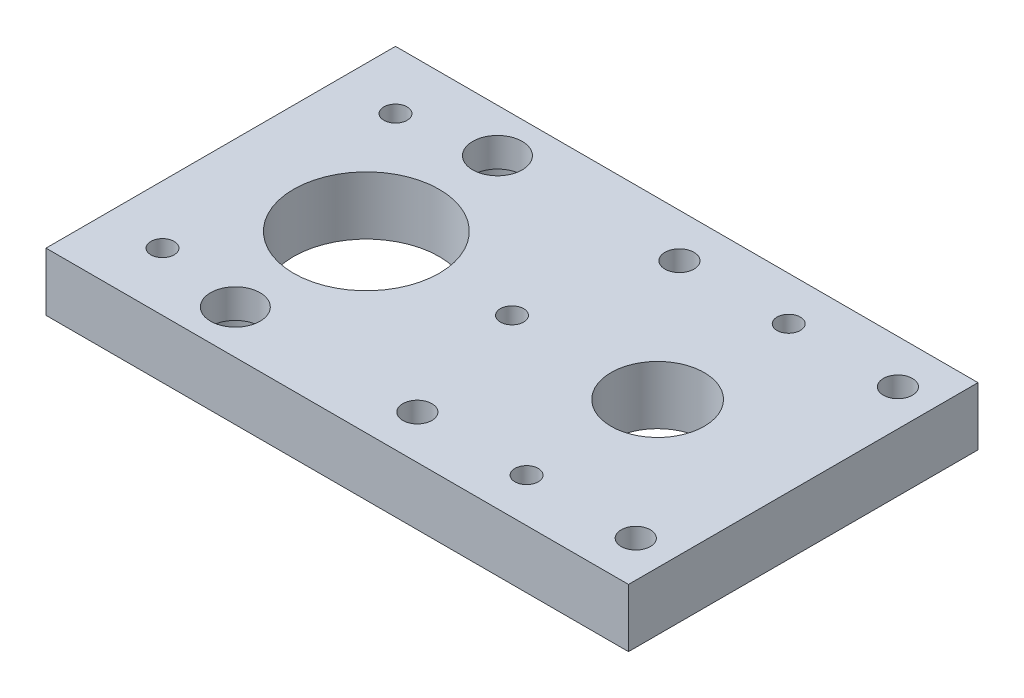
ISO-10303-21;
HEADER;
FILE_DESCRIPTION(('STEP AP214'),'2;1');
FILE_NAME('part.step','',(''),(''),'','','');
FILE_SCHEMA(('AUTOMOTIVE_DESIGN { 1 0 10303 214 1 1 1 1 }'));
ENDSEC;
DATA;
#1=APPLICATION_CONTEXT('core data for automotive mechanical design processes');
#2=APPLICATION_PROTOCOL_DEFINITION('international standard','automotive_design',2000,#1);
#3=PRODUCT_CONTEXT('',#1,'mechanical');
#4=PRODUCT('Part','Part','',(#3));
#5=PRODUCT_RELATED_PRODUCT_CATEGORY('part','',(#4));
#6=PRODUCT_DEFINITION_FORMATION('','',#4);
#7=PRODUCT_DEFINITION_CONTEXT('part definition',#1,'design');
#8=PRODUCT_DEFINITION('design','',#6,#7);
#9=PRODUCT_DEFINITION_SHAPE('','',#8);
#10=(LENGTH_UNIT() NAMED_UNIT(*) SI_UNIT(.MILLI.,.METRE.));
#11=(NAMED_UNIT(*) PLANE_ANGLE_UNIT() SI_UNIT($,.RADIAN.));
#12=(NAMED_UNIT(*) SI_UNIT($,.STERADIAN.) SOLID_ANGLE_UNIT());
#13=UNCERTAINTY_MEASURE_WITH_UNIT(LENGTH_MEASURE(1.E-05),#10,'distance_accuracy_value','');
#14=(GEOMETRIC_REPRESENTATION_CONTEXT(3) GLOBAL_UNCERTAINTY_ASSIGNED_CONTEXT((#13)) GLOBAL_UNIT_ASSIGNED_CONTEXT((#10,
#11,#12)) REPRESENTATION_CONTEXT('',''));
#15=CARTESIAN_POINT('',(0.,0.,0.));
#16=DIRECTION('',(0.,0.,1.));
#17=DIRECTION('',(1.,0.,0.));
#18=AXIS2_PLACEMENT_3D('',#15,#16,#17);
#19=CARTESIAN_POINT('',(0.,2.,0.));
#20=DIRECTION('',(0.,-1.,0.));
#21=DIRECTION('',(0.,0.,-1.));
#22=AXIS2_PLACEMENT_3D('',#19,#20,#21);
#23=CYLINDRICAL_SURFACE('',#22,1.6);
#24=CARTESIAN_POINT('',(0.,2.,0.));
#25=DIRECTION('',(0.,1.,0.));
#26=DIRECTION('',(0.,0.,1.));
#27=AXIS2_PLACEMENT_3D('',#24,#25,#26);
#28=CIRCLE('',#27,1.6);
#29=CARTESIAN_POINT('',(0.,2.,1.60000000000001));
#30=VERTEX_POINT('',#29);
#31=EDGE_CURVE('E242',#30,#30,#28,.T.);
#32=ORIENTED_EDGE('',*,*,#31,.T.);
#33=EDGE_LOOP('',(#32));
#34=FACE_BOUND('',#33,.T.);
#35=CARTESIAN_POINT('',(0.,0.,0.));
#36=DIRECTION('',(0.,1.,0.));
#37=DIRECTION('',(0.,0.,1.));
#38=AXIS2_PLACEMENT_3D('',#35,#36,#37);
#39=CIRCLE('',#38,1.6);
#40=CARTESIAN_POINT('',(0.,0.,1.60000000000001));
#41=VERTEX_POINT('',#40);
#42=EDGE_CURVE('E236',#41,#41,#39,.T.);
#43=ORIENTED_EDGE('',*,*,#42,.F.);
#44=EDGE_LOOP('',(#43));
#45=FACE_BOUND('',#44,.T.);
#46=ADVANCED_FACE('F133',(#34,#45),#23,.F.);
#47=CARTESIAN_POINT('',(-10.,2.,0.));
#48=DIRECTION('',(0.,-1.,0.));
#49=DIRECTION('',(0.,0.,-1.));
#50=AXIS2_PLACEMENT_3D('',#47,#48,#49);
#51=CYLINDRICAL_SURFACE('',#50,2.5);
#52=CARTESIAN_POINT('',(-10.,2.,0.));
#53=DIRECTION('',(0.,1.,0.));
#54=DIRECTION('',(0.,0.,1.));
#55=AXIS2_PLACEMENT_3D('',#52,#53,#54);
#56=CIRCLE('',#55,2.5);
#57=CARTESIAN_POINT('',(-10.,2.,2.50000000000001));
#58=VERTEX_POINT('',#57);
#59=EDGE_CURVE('E239',#58,#58,#56,.T.);
#60=ORIENTED_EDGE('',*,*,#59,.T.);
#61=EDGE_LOOP('',(#60));
#62=FACE_BOUND('',#61,.T.);
#63=CARTESIAN_POINT('',(-10.,0.,0.));
#64=DIRECTION('',(0.,1.,0.));
#65=DIRECTION('',(0.,0.,1.));
#66=AXIS2_PLACEMENT_3D('',#63,#64,#65);
#67=CIRCLE('',#66,2.5);
#68=CARTESIAN_POINT('',(-10.,0.,2.50000000000001));
#69=VERTEX_POINT('',#68);
#70=EDGE_CURVE('E252',#69,#69,#67,.T.);
#71=ORIENTED_EDGE('',*,*,#70,.F.);
#72=EDGE_LOOP('',(#71));
#73=FACE_BOUND('',#72,.T.);
#74=ADVANCED_FACE('F261',(#62,#73),#51,.F.);
#75=CARTESIAN_POINT('',(-15.,2.,0.));
#76=DIRECTION('',(1.,0.,0.));
#77=DIRECTION('',(0.,0.,-1.));
#78=AXIS2_PLACEMENT_3D('',#75,#76,#77);
#79=PLANE('',#78);
#80=DIRECTION('',(0.,0.,1.));
#81=VECTOR('',#80,1.);
#82=CARTESIAN_POINT('',(-15.,0.,0.));
#83=LINE('',#82,#81);
#84=CARTESIAN_POINT('',(-15.,0.,-6.));
#85=VERTEX_POINT('',#84);
#86=CARTESIAN_POINT('',(-15.,0.,6.));
#87=VERTEX_POINT('',#86);
#88=EDGE_CURVE('E196',#85,#87,#83,.T.);
#89=ORIENTED_EDGE('',*,*,#88,.T.);
#90=DIRECTION('',(0.,-1.,0.));
#91=VECTOR('',#90,1.);
#92=CARTESIAN_POINT('',(-15.,2.,6.));
#93=LINE('',#92,#91);
#94=CARTESIAN_POINT('',(-15.,2.,6.));
#95=VERTEX_POINT('',#94);
#96=EDGE_CURVE('E143',#95,#87,#93,.T.);
#97=ORIENTED_EDGE('',*,*,#96,.F.);
#98=DIRECTION('',(0.,0.,1.));
#99=VECTOR('',#98,1.);
#100=CARTESIAN_POINT('',(-15.,2.,0.));
#101=LINE('',#100,#99);
#102=CARTESIAN_POINT('',(-15.,2.,-6.));
#103=VERTEX_POINT('',#102);
#104=EDGE_CURVE('E186',#103,#95,#101,.T.);
#105=ORIENTED_EDGE('',*,*,#104,.F.);
#106=DIRECTION('',(0.,-1.,0.));
#107=VECTOR('',#106,1.);
#108=CARTESIAN_POINT('',(-15.,2.,-6.));
#109=LINE('',#108,#107);
#110=EDGE_CURVE('E13',#103,#85,#109,.T.);
#111=ORIENTED_EDGE('',*,*,#110,.T.);
#112=EDGE_LOOP('',(#89,#97,#105,#111));
#113=FACE_BOUND('',#112,.T.);
#114=ADVANCED_FACE('F194',(#113),#79,.F.);
#115=CARTESIAN_POINT('',(0.,2.,6.));
#116=DIRECTION('',(0.,0.,-1.));
#117=DIRECTION('',(-1.,0.,0.));
#118=AXIS2_PLACEMENT_3D('',#115,#116,#117);
#119=PLANE('',#118);
#120=DIRECTION('',(1.,0.,0.));
#121=VECTOR('',#120,1.);
#122=CARTESIAN_POINT('',(0.,0.,6.));
#123=LINE('',#122,#121);
#124=CARTESIAN_POINT('',(4.99999999999999,0.,6.));
#125=VERTEX_POINT('',#124);
#126=EDGE_CURVE('E247',#87,#125,#123,.T.);
#127=ORIENTED_EDGE('',*,*,#126,.T.);
#128=DIRECTION('',(0.,-1.,0.));
#129=VECTOR('',#128,1.);
#130=CARTESIAN_POINT('',(4.99999999999999,2.,6.));
#131=LINE('',#130,#129);
#132=CARTESIAN_POINT('',(4.99999999999999,2.,6.));
#133=VERTEX_POINT('',#132);
#134=EDGE_CURVE('E166',#133,#125,#131,.T.);
#135=ORIENTED_EDGE('',*,*,#134,.F.);
#136=DIRECTION('',(1.,0.,0.));
#137=VECTOR('',#136,1.);
#138=CARTESIAN_POINT('',(0.,2.,6.));
#139=LINE('',#138,#137);
#140=EDGE_CURVE('E178',#95,#133,#139,.T.);
#141=ORIENTED_EDGE('',*,*,#140,.F.);
#142=ORIENTED_EDGE('',*,*,#96,.T.);
#143=EDGE_LOOP('',(#127,#135,#141,#142));
#144=FACE_BOUND('',#143,.T.);
#145=ADVANCED_FACE('F180',(#144),#119,.F.);
#146=CARTESIAN_POINT('',(4.99999999999999,2.,0.));
#147=DIRECTION('',(1.,0.,0.));
#148=DIRECTION('',(0.,0.,-1.));
#149=AXIS2_PLACEMENT_3D('',#146,#147,#148);
#150=PLANE('',#149);
#151=DIRECTION('',(0.,0.,1.));
#152=VECTOR('',#151,1.);
#153=CARTESIAN_POINT('',(4.99999999999999,0.,0.));
#154=LINE('',#153,#152);
#155=CARTESIAN_POINT('',(4.99999999999999,0.,-6.));
#156=VERTEX_POINT('',#155);
#157=EDGE_CURVE('E249',#156,#125,#154,.T.);
#158=ORIENTED_EDGE('',*,*,#157,.F.);
#159=DIRECTION('',(0.,-1.,0.));
#160=VECTOR('',#159,1.);
#161=CARTESIAN_POINT('',(4.99999999999999,2.,-6.));
#162=LINE('',#161,#160);
#163=CARTESIAN_POINT('',(4.99999999999999,2.,-6.));
#164=VERTEX_POINT('',#163);
#165=EDGE_CURVE('E152',#164,#156,#162,.T.);
#166=ORIENTED_EDGE('',*,*,#165,.F.);
#167=DIRECTION('',(0.,0.,1.));
#168=VECTOR('',#167,1.);
#169=CARTESIAN_POINT('',(4.99999999999999,2.,0.));
#170=LINE('',#169,#168);
#171=EDGE_CURVE('E185',#164,#133,#170,.T.);
#172=ORIENTED_EDGE('',*,*,#171,.T.);
#173=ORIENTED_EDGE('',*,*,#134,.T.);
#174=EDGE_LOOP('',(#158,#166,#172,#173));
#175=FACE_BOUND('',#174,.T.);
#176=ADVANCED_FACE('F272',(#175),#150,.T.);
#177=CARTESIAN_POINT('',(0.,2.,-6.));
#178=DIRECTION('',(0.,0.,-1.));
#179=DIRECTION('',(-1.,0.,0.));
#180=AXIS2_PLACEMENT_3D('',#177,#178,#179);
#181=PLANE('',#180);
#182=DIRECTION('',(1.,0.,0.));
#183=VECTOR('',#182,1.);
#184=CARTESIAN_POINT('',(0.,0.,-6.));
#185=LINE('',#184,#183);
#186=EDGE_CURVE('E234',#85,#156,#185,.T.);
#187=ORIENTED_EDGE('',*,*,#186,.F.);
#188=ORIENTED_EDGE('',*,*,#110,.F.);
#189=DIRECTION('',(1.,0.,0.));
#190=VECTOR('',#189,1.);
#191=CARTESIAN_POINT('',(0.,2.,-6.));
#192=LINE('',#191,#190);
#193=EDGE_CURVE('E191',#103,#164,#192,.T.);
#194=ORIENTED_EDGE('',*,*,#193,.T.);
#195=ORIENTED_EDGE('',*,*,#165,.T.);
#196=EDGE_LOOP('',(#187,#188,#194,#195));
#197=FACE_BOUND('',#196,.T.);
#198=ADVANCED_FACE('F135',(#197),#181,.T.);
#199=CARTESIAN_POINT('',(0.,0.,0.));
#200=DIRECTION('',(0.,1.,0.));
#201=DIRECTION('',(0.,0.,1.));
#202=AXIS2_PLACEMENT_3D('',#199,#200,#201);
#203=PLANE('',#202);
#204=CARTESIAN_POINT('',(0.,0.,4.5));
#205=DIRECTION('',(0.,-1.,0.));
#206=DIRECTION('',(0.,0.,-1.));
#207=AXIS2_PLACEMENT_3D('',#204,#205,#206);
#208=CIRCLE('',#207,0.4);
#209=CARTESIAN_POINT('',(0.,0.,4.1));
#210=VERTEX_POINT('',#209);
#211=EDGE_CURVE('E648',#210,#210,#208,.T.);
#212=ORIENTED_EDGE('',*,*,#211,.F.);
#213=EDGE_LOOP('',(#212));
#214=FACE_BOUND('',#213,.T.);
#215=CARTESIAN_POINT('',(0.,0.,-4.5));
#216=DIRECTION('',(0.,-1.,0.));
#217=DIRECTION('',(0.,0.,-1.));
#218=AXIS2_PLACEMENT_3D('',#215,#216,#217);
#219=CIRCLE('',#218,0.4);
#220=CARTESIAN_POINT('',(0.,0.,-4.9));
#221=VERTEX_POINT('',#220);
#222=EDGE_CURVE('E652',#221,#221,#219,.T.);
#223=ORIENTED_EDGE('',*,*,#222,.F.);
#224=EDGE_LOOP('',(#223));
#225=FACE_BOUND('',#224,.T.);
#226=CARTESIAN_POINT('',(-13.,0.,-4.));
#227=DIRECTION('',(0.,-1.,0.));
#228=DIRECTION('',(0.,0.,-1.));
#229=AXIS2_PLACEMENT_3D('',#226,#227,#228);
#230=CIRCLE('',#229,0.399999999999999);
#231=CARTESIAN_POINT('',(-13.,0.,-4.4));
#232=VERTEX_POINT('',#231);
#233=EDGE_CURVE('E758',#232,#232,#230,.T.);
#234=ORIENTED_EDGE('',*,*,#233,.F.);
#235=EDGE_LOOP('',(#234));
#236=FACE_BOUND('',#235,.T.);
#237=CARTESIAN_POINT('',(-4.99999999999999,0.,0.));
#238=DIRECTION('',(0.,-1.,0.));
#239=DIRECTION('',(0.,0.,-1.));
#240=AXIS2_PLACEMENT_3D('',#237,#238,#239);
#241=CIRCLE('',#240,0.400000000000001);
#242=CARTESIAN_POINT('',(-4.99999999999999,0.,-0.400000000000001));
#243=VERTEX_POINT('',#242);
#244=EDGE_CURVE('E664',#243,#243,#241,.T.);
#245=ORIENTED_EDGE('',*,*,#244,.F.);
#246=EDGE_LOOP('',(#245));
#247=FACE_BOUND('',#246,.T.);
#248=CARTESIAN_POINT('',(-13.,0.,4.));
#249=DIRECTION('',(0.,-1.,0.));
#250=DIRECTION('',(0.,0.,-1.));
#251=AXIS2_PLACEMENT_3D('',#248,#249,#250);
#252=CIRCLE('',#251,0.4);
#253=CARTESIAN_POINT('',(-13.,0.,3.6));
#254=VERTEX_POINT('',#253);
#255=EDGE_CURVE('E661',#254,#254,#252,.T.);
#256=ORIENTED_EDGE('',*,*,#255,.F.);
#257=EDGE_LOOP('',(#256));
#258=FACE_BOUND('',#257,.T.);
#259=CARTESIAN_POINT('',(-9.99999999999999,0.,4.50000000000001));
#260=DIRECTION('',(0.,1.,0.));
#261=DIRECTION('',(0.,0.,1.));
#262=AXIS2_PLACEMENT_3D('',#259,#260,#261);
#263=CIRCLE('',#262,1.1);
#264=CARTESIAN_POINT('',(-9.99999999999999,0.,5.60000000000001));
#265=VERTEX_POINT('',#264);
#266=EDGE_CURVE('E674',#265,#265,#263,.T.);
#267=ORIENTED_EDGE('',*,*,#266,.T.);
#268=EDGE_LOOP('',(#267));
#269=FACE_BOUND('',#268,.T.);
#270=CARTESIAN_POINT('',(-3.75,0.,4.5));
#271=DIRECTION('',(0.,1.,0.));
#272=DIRECTION('',(0.,0.,1.));
#273=AXIS2_PLACEMENT_3D('',#270,#271,#272);
#274=CIRCLE('',#273,1.);
#275=CARTESIAN_POINT('',(-3.75,0.,5.5));
#276=VERTEX_POINT('',#275);
#277=EDGE_CURVE('E675',#276,#276,#274,.T.);
#278=ORIENTED_EDGE('',*,*,#277,.T.);
#279=EDGE_LOOP('',(#278));
#280=FACE_BOUND('',#279,.T.);
#281=CARTESIAN_POINT('',(-3.75,0.,-4.5));
#282=DIRECTION('',(0.,1.,0.));
#283=DIRECTION('',(0.,0.,1.));
#284=AXIS2_PLACEMENT_3D('',#281,#282,#283);
#285=CIRCLE('',#284,1.);
#286=CARTESIAN_POINT('',(-3.75,0.,-3.5));
#287=VERTEX_POINT('',#286);
#288=EDGE_CURVE('E682',#287,#287,#285,.T.);
#289=ORIENTED_EDGE('',*,*,#288,.T.);
#290=EDGE_LOOP('',(#289));
#291=FACE_BOUND('',#290,.T.);
#292=CARTESIAN_POINT('',(3.75,0.,-4.5));
#293=DIRECTION('',(0.,1.,0.));
#294=DIRECTION('',(0.,0.,1.));
#295=AXIS2_PLACEMENT_3D('',#292,#293,#294);
#296=CIRCLE('',#295,0.999999999999999);
#297=CARTESIAN_POINT('',(3.75,0.,-3.5));
#298=VERTEX_POINT('',#297);
#299=EDGE_CURVE('E688',#298,#298,#296,.T.);
#300=ORIENTED_EDGE('',*,*,#299,.T.);
#301=EDGE_LOOP('',(#300));
#302=FACE_BOUND('',#301,.T.);
#303=CARTESIAN_POINT('',(3.75,0.,4.5));
#304=DIRECTION('',(0.,1.,0.));
#305=DIRECTION('',(0.,0.,1.));
#306=AXIS2_PLACEMENT_3D('',#303,#304,#305);
#307=CIRCLE('',#306,0.999999999999999);
#308=CARTESIAN_POINT('',(3.75,0.,5.5));
#309=VERTEX_POINT('',#308);
#310=EDGE_CURVE('E667',#309,#309,#307,.T.);
#311=ORIENTED_EDGE('',*,*,#310,.T.);
#312=EDGE_LOOP('',(#311));
#313=FACE_BOUND('',#312,.T.);
#314=CARTESIAN_POINT('',(-9.99999999999999,0.,-4.49999999999999));
#315=DIRECTION('',(0.,1.,0.));
#316=DIRECTION('',(0.,0.,1.));
#317=AXIS2_PLACEMENT_3D('',#314,#315,#316);
#318=CIRCLE('',#317,1.1);
#319=CARTESIAN_POINT('',(-9.99999999999999,0.,-3.39999999999999));
#320=VERTEX_POINT('',#319);
#321=EDGE_CURVE('E678',#320,#320,#318,.T.);
#322=ORIENTED_EDGE('',*,*,#321,.T.);
#323=EDGE_LOOP('',(#322));
#324=FACE_BOUND('',#323,.T.);
#325=ORIENTED_EDGE('',*,*,#186,.T.);
#326=ORIENTED_EDGE('',*,*,#157,.T.);
#327=ORIENTED_EDGE('',*,*,#126,.F.);
#328=ORIENTED_EDGE('',*,*,#88,.F.);
#329=EDGE_LOOP('',(#325,#326,#327,#328));
#330=FACE_BOUND('',#329,.T.);
#331=ORIENTED_EDGE('',*,*,#70,.T.);
#332=EDGE_LOOP('',(#331));
#333=FACE_BOUND('',#332,.T.);
#334=ORIENTED_EDGE('',*,*,#42,.T.);
#335=EDGE_LOOP('',(#334));
#336=FACE_BOUND('',#335,.T.);
#337=ADVANCED_FACE('F258',(#214,#225,#236,#247,#258,#269,#280,#291,#302,#313,#324,#330,#333,
#336),#203,.F.);
#338=CARTESIAN_POINT('',(0.,2.,0.));
#339=DIRECTION('',(0.,1.,0.));
#340=DIRECTION('',(0.,0.,1.));
#341=AXIS2_PLACEMENT_3D('',#338,#339,#340);
#342=PLANE('',#341);
#343=CARTESIAN_POINT('',(0.,2.,4.5));
#344=DIRECTION('',(0.,-1.,0.));
#345=DIRECTION('',(0.,0.,-1.));
#346=AXIS2_PLACEMENT_3D('',#343,#344,#345);
#347=CIRCLE('',#346,0.4);
#348=CARTESIAN_POINT('',(0.,2.,4.1));
#349=VERTEX_POINT('',#348);
#350=EDGE_CURVE('E645',#349,#349,#347,.T.);
#351=ORIENTED_EDGE('',*,*,#350,.T.);
#352=EDGE_LOOP('',(#351));
#353=FACE_BOUND('',#352,.T.);
#354=CARTESIAN_POINT('',(0.,2.,-4.5));
#355=DIRECTION('',(0.,-1.,0.));
#356=DIRECTION('',(0.,0.,-1.));
#357=AXIS2_PLACEMENT_3D('',#354,#355,#356);
#358=CIRCLE('',#357,0.4);
#359=CARTESIAN_POINT('',(0.,2.,-4.9));
#360=VERTEX_POINT('',#359);
#361=EDGE_CURVE('E649',#360,#360,#358,.T.);
#362=ORIENTED_EDGE('',*,*,#361,.T.);
#363=EDGE_LOOP('',(#362));
#364=FACE_BOUND('',#363,.T.);
#365=CARTESIAN_POINT('',(-13.,2.,-4.));
#366=DIRECTION('',(0.,-1.,0.));
#367=DIRECTION('',(0.,0.,-1.));
#368=AXIS2_PLACEMENT_3D('',#365,#366,#367);
#369=CIRCLE('',#368,0.399999999999999);
#370=CARTESIAN_POINT('',(-13.,2.,-4.4));
#371=VERTEX_POINT('',#370);
#372=EDGE_CURVE('E763',#371,#371,#369,.T.);
#373=ORIENTED_EDGE('',*,*,#372,.T.);
#374=EDGE_LOOP('',(#373));
#375=FACE_BOUND('',#374,.T.);
#376=CARTESIAN_POINT('',(-4.99999999999999,2.,0.));
#377=DIRECTION('',(0.,-1.,0.));
#378=DIRECTION('',(0.,0.,-1.));
#379=AXIS2_PLACEMENT_3D('',#376,#377,#378);
#380=CIRCLE('',#379,0.400000000000001);
#381=CARTESIAN_POINT('',(-4.99999999999999,2.,-0.400000000000001));
#382=VERTEX_POINT('',#381);
#383=EDGE_CURVE('E753',#382,#382,#380,.T.);
#384=ORIENTED_EDGE('',*,*,#383,.T.);
#385=EDGE_LOOP('',(#384));
#386=FACE_BOUND('',#385,.T.);
#387=CARTESIAN_POINT('',(-13.,2.,4.));
#388=DIRECTION('',(0.,-1.,0.));
#389=DIRECTION('',(0.,0.,-1.));
#390=AXIS2_PLACEMENT_3D('',#387,#388,#389);
#391=CIRCLE('',#390,0.4);
#392=CARTESIAN_POINT('',(-13.,2.,3.6));
#393=VERTEX_POINT('',#392);
#394=EDGE_CURVE('E657',#393,#393,#391,.T.);
#395=ORIENTED_EDGE('',*,*,#394,.T.);
#396=EDGE_LOOP('',(#395));
#397=FACE_BOUND('',#396,.T.);
#398=CARTESIAN_POINT('',(-9.99999999999999,2.,4.50000000000001));
#399=DIRECTION('',(0.,1.,0.));
#400=DIRECTION('',(0.,0.,1.));
#401=AXIS2_PLACEMENT_3D('',#398,#399,#400);
#402=CIRCLE('',#401,0.85);
#403=CARTESIAN_POINT('',(-9.99999999999999,2.,5.35000000000001));
#404=VERTEX_POINT('',#403);
#405=EDGE_CURVE('E218',#404,#404,#402,.T.);
#406=ORIENTED_EDGE('',*,*,#405,.F.);
#407=EDGE_LOOP('',(#406));
#408=FACE_BOUND('',#407,.T.);
#409=CARTESIAN_POINT('',(-3.75,2.,4.5));
#410=DIRECTION('',(0.,1.,0.));
#411=DIRECTION('',(0.,0.,1.));
#412=AXIS2_PLACEMENT_3D('',#409,#410,#411);
#413=CIRCLE('',#412,0.5);
#414=CARTESIAN_POINT('',(-3.75,2.,5.));
#415=VERTEX_POINT('',#414);
#416=EDGE_CURVE('E222',#415,#415,#413,.T.);
#417=ORIENTED_EDGE('',*,*,#416,.F.);
#418=EDGE_LOOP('',(#417));
#419=FACE_BOUND('',#418,.T.);
#420=CARTESIAN_POINT('',(3.75,2.,4.5));
#421=DIRECTION('',(0.,1.,0.));
#422=DIRECTION('',(0.,0.,1.));
#423=AXIS2_PLACEMENT_3D('',#420,#421,#422);
#424=CIRCLE('',#423,0.5);
#425=CARTESIAN_POINT('',(3.75,2.,5.));
#426=VERTEX_POINT('',#425);
#427=EDGE_CURVE('E227',#426,#426,#424,.T.);
#428=ORIENTED_EDGE('',*,*,#427,.F.);
#429=EDGE_LOOP('',(#428));
#430=FACE_BOUND('',#429,.T.);
#431=CARTESIAN_POINT('',(3.75,2.,-4.5));
#432=DIRECTION('',(0.,1.,0.));
#433=DIRECTION('',(0.,0.,1.));
#434=AXIS2_PLACEMENT_3D('',#431,#432,#433);
#435=CIRCLE('',#434,0.5);
#436=CARTESIAN_POINT('',(3.75,2.,-4.));
#437=VERTEX_POINT('',#436);
#438=EDGE_CURVE('E701',#437,#437,#435,.T.);
#439=ORIENTED_EDGE('',*,*,#438,.F.);
#440=EDGE_LOOP('',(#439));
#441=FACE_BOUND('',#440,.T.);
#442=CARTESIAN_POINT('',(-3.75,2.,-4.5));
#443=DIRECTION('',(0.,1.,0.));
#444=DIRECTION('',(0.,0.,1.));
#445=AXIS2_PLACEMENT_3D('',#442,#443,#444);
#446=CIRCLE('',#445,0.5);
#447=CARTESIAN_POINT('',(-3.75,2.,-4.));
#448=VERTEX_POINT('',#447);
#449=EDGE_CURVE('E235',#448,#448,#446,.T.);
#450=ORIENTED_EDGE('',*,*,#449,.F.);
#451=EDGE_LOOP('',(#450));
#452=FACE_BOUND('',#451,.T.);
#453=CARTESIAN_POINT('',(-9.99999999999999,2.,-4.49999999999999));
#454=DIRECTION('',(0.,1.,0.));
#455=DIRECTION('',(0.,0.,1.));
#456=AXIS2_PLACEMENT_3D('',#453,#454,#455);
#457=CIRCLE('',#456,0.85);
#458=CARTESIAN_POINT('',(-9.99999999999999,2.,-3.64999999999999));
#459=VERTEX_POINT('',#458);
#460=EDGE_CURVE('E231',#459,#459,#457,.T.);
#461=ORIENTED_EDGE('',*,*,#460,.F.);
#462=EDGE_LOOP('',(#461));
#463=FACE_BOUND('',#462,.T.);
#464=ORIENTED_EDGE('',*,*,#193,.F.);
#465=ORIENTED_EDGE('',*,*,#104,.T.);
#466=ORIENTED_EDGE('',*,*,#140,.T.);
#467=ORIENTED_EDGE('',*,*,#171,.F.);
#468=EDGE_LOOP('',(#464,#465,#466,#467));
#469=FACE_BOUND('',#468,.T.);
#470=ORIENTED_EDGE('',*,*,#59,.F.);
#471=EDGE_LOOP('',(#470));
#472=FACE_BOUND('',#471,.T.);
#473=ORIENTED_EDGE('',*,*,#31,.F.);
#474=EDGE_LOOP('',(#473));
#475=FACE_BOUND('',#474,.T.);
#476=ADVANCED_FACE('F189',(#353,#364,#375,#386,#397,#408,#419,#430,#441,#452,#463,#469,#472,
#475),#342,.T.);
#477=CARTESIAN_POINT('',(-9.99999999999999,2.,-4.49999999999999));
#478=DIRECTION('',(0.,-1.,0.));
#479=DIRECTION('',(0.,0.,-1.));
#480=AXIS2_PLACEMENT_3D('',#477,#478,#479);
#481=CYLINDRICAL_SURFACE('',#480,0.85);
#482=CARTESIAN_POINT('',(-9.99999999999999,1.,-4.49999999999999));
#483=DIRECTION('',(0.,1.,0.));
#484=DIRECTION('',(0.,0.,1.));
#485=AXIS2_PLACEMENT_3D('',#482,#483,#484);
#486=CIRCLE('',#485,0.85);
#487=CARTESIAN_POINT('',(-9.99999999999999,1.,-3.64999999999999));
#488=VERTEX_POINT('',#487);
#489=EDGE_CURVE('E137',#488,#488,#486,.T.);
#490=ORIENTED_EDGE('',*,*,#489,.F.);
#491=EDGE_LOOP('',(#490));
#492=FACE_BOUND('',#491,.T.);
#493=ORIENTED_EDGE('',*,*,#460,.T.);
#494=EDGE_LOOP('',(#493));
#495=FACE_BOUND('',#494,.T.);
#496=ADVANCED_FACE('F308',(#492,#495),#481,.F.);
#497=CARTESIAN_POINT('',(-3.75,2.,-4.5));
#498=DIRECTION('',(0.,-1.,0.));
#499=DIRECTION('',(0.,0.,-1.));
#500=AXIS2_PLACEMENT_3D('',#497,#498,#499);
#501=CYLINDRICAL_SURFACE('',#500,0.5);
#502=CARTESIAN_POINT('',(-3.75,1.,-4.5));
#503=DIRECTION('',(0.,1.,0.));
#504=DIRECTION('',(0.,0.,1.));
#505=AXIS2_PLACEMENT_3D('',#502,#503,#504);
#506=CIRCLE('',#505,0.5);
#507=CARTESIAN_POINT('',(-3.75,1.,-4.));
#508=VERTEX_POINT('',#507);
#509=EDGE_CURVE('E213',#508,#508,#506,.T.);
#510=ORIENTED_EDGE('',*,*,#509,.F.);
#511=EDGE_LOOP('',(#510));
#512=FACE_BOUND('',#511,.T.);
#513=ORIENTED_EDGE('',*,*,#449,.T.);
#514=EDGE_LOOP('',(#513));
#515=FACE_BOUND('',#514,.T.);
#516=ADVANCED_FACE('F315',(#512,#515),#501,.F.);
#517=CARTESIAN_POINT('',(3.75,2.,-4.5));
#518=DIRECTION('',(0.,-1.,0.));
#519=DIRECTION('',(0.,0.,-1.));
#520=AXIS2_PLACEMENT_3D('',#517,#518,#519);
#521=CYLINDRICAL_SURFACE('',#520,0.5);
#522=CARTESIAN_POINT('',(3.75,1.,-4.5));
#523=DIRECTION('',(0.,1.,0.));
#524=DIRECTION('',(0.,0.,1.));
#525=AXIS2_PLACEMENT_3D('',#522,#523,#524);
#526=CIRCLE('',#525,0.5);
#527=CARTESIAN_POINT('',(3.75,1.,-4.));
#528=VERTEX_POINT('',#527);
#529=EDGE_CURVE('E211',#528,#528,#526,.T.);
#530=ORIENTED_EDGE('',*,*,#529,.F.);
#531=EDGE_LOOP('',(#530));
#532=FACE_BOUND('',#531,.T.);
#533=ORIENTED_EDGE('',*,*,#438,.T.);
#534=EDGE_LOOP('',(#533));
#535=FACE_BOUND('',#534,.T.);
#536=ADVANCED_FACE('F323',(#532,#535),#521,.F.);
#537=CARTESIAN_POINT('',(3.75,2.,4.5));
#538=DIRECTION('',(0.,-1.,0.));
#539=DIRECTION('',(0.,0.,-1.));
#540=AXIS2_PLACEMENT_3D('',#537,#538,#539);
#541=CYLINDRICAL_SURFACE('',#540,0.5);
#542=CARTESIAN_POINT('',(3.75,1.,4.5));
#543=DIRECTION('',(0.,1.,0.));
#544=DIRECTION('',(0.,0.,1.));
#545=AXIS2_PLACEMENT_3D('',#542,#543,#544);
#546=CIRCLE('',#545,0.5);
#547=CARTESIAN_POINT('',(3.75,1.,5.));
#548=VERTEX_POINT('',#547);
#549=EDGE_CURVE('E208',#548,#548,#546,.T.);
#550=ORIENTED_EDGE('',*,*,#549,.F.);
#551=EDGE_LOOP('',(#550));
#552=FACE_BOUND('',#551,.T.);
#553=ORIENTED_EDGE('',*,*,#427,.T.);
#554=EDGE_LOOP('',(#553));
#555=FACE_BOUND('',#554,.T.);
#556=ADVANCED_FACE('F331',(#552,#555),#541,.F.);
#557=CARTESIAN_POINT('',(-3.75,2.,4.5));
#558=DIRECTION('',(0.,-1.,0.));
#559=DIRECTION('',(0.,0.,-1.));
#560=AXIS2_PLACEMENT_3D('',#557,#558,#559);
#561=CYLINDRICAL_SURFACE('',#560,0.5);
#562=CARTESIAN_POINT('',(-3.75,1.,4.5));
#563=DIRECTION('',(0.,1.,0.));
#564=DIRECTION('',(0.,0.,1.));
#565=AXIS2_PLACEMENT_3D('',#562,#563,#564);
#566=CIRCLE('',#565,0.5);
#567=CARTESIAN_POINT('',(-3.75,1.,5.));
#568=VERTEX_POINT('',#567);
#569=EDGE_CURVE('E204',#568,#568,#566,.T.);
#570=ORIENTED_EDGE('',*,*,#569,.F.);
#571=EDGE_LOOP('',(#570));
#572=FACE_BOUND('',#571,.T.);
#573=ORIENTED_EDGE('',*,*,#416,.T.);
#574=EDGE_LOOP('',(#573));
#575=FACE_BOUND('',#574,.T.);
#576=ADVANCED_FACE('F339',(#572,#575),#561,.F.);
#577=CARTESIAN_POINT('',(-9.99999999999999,2.,4.50000000000001));
#578=DIRECTION('',(0.,-1.,0.));
#579=DIRECTION('',(0.,0.,-1.));
#580=AXIS2_PLACEMENT_3D('',#577,#578,#579);
#581=CYLINDRICAL_SURFACE('',#580,0.85);
#582=CARTESIAN_POINT('',(-9.99999999999999,1.,4.50000000000001));
#583=DIRECTION('',(0.,1.,0.));
#584=DIRECTION('',(0.,0.,1.));
#585=AXIS2_PLACEMENT_3D('',#582,#583,#584);
#586=CIRCLE('',#585,0.85);
#587=CARTESIAN_POINT('',(-9.99999999999999,1.,5.35000000000001));
#588=VERTEX_POINT('',#587);
#589=EDGE_CURVE('E201',#588,#588,#586,.T.);
#590=ORIENTED_EDGE('',*,*,#589,.F.);
#591=EDGE_LOOP('',(#590));
#592=FACE_BOUND('',#591,.T.);
#593=ORIENTED_EDGE('',*,*,#405,.T.);
#594=EDGE_LOOP('',(#593));
#595=FACE_BOUND('',#594,.T.);
#596=ADVANCED_FACE('F347',(#592,#595),#581,.F.);
#597=CARTESIAN_POINT('',(-9.99999999999999,5.11126983722081,4.50000000000001));
#598=DIRECTION('',(0.,-1.,0.));
#599=DIRECTION('',(0.,0.,-1.));
#600=AXIS2_PLACEMENT_3D('',#597,#598,#599);
#601=CYLINDRICAL_SURFACE('',#600,1.1);
#602=ORIENTED_EDGE('',*,*,#266,.F.);
#603=EDGE_LOOP('',(#602));
#604=FACE_BOUND('',#603,.T.);
#605=CARTESIAN_POINT('',(-9.99999999999999,1.,4.50000000000001));
#606=DIRECTION('',(0.,1.,0.));
#607=DIRECTION('',(0.,0.,1.));
#608=AXIS2_PLACEMENT_3D('',#605,#606,#607);
#609=CIRCLE('',#608,1.1);
#610=CARTESIAN_POINT('',(-9.99999999999999,1.,5.60000000000001));
#611=VERTEX_POINT('',#610);
#612=EDGE_CURVE('E671',#611,#611,#609,.T.);
#613=ORIENTED_EDGE('',*,*,#612,.T.);
#614=EDGE_LOOP('',(#613));
#615=FACE_BOUND('',#614,.T.);
#616=ADVANCED_FACE('F355',(#604,#615),#601,.F.);
#617=CARTESIAN_POINT('',(0.,1.,0.));
#618=DIRECTION('',(0.,1.,0.));
#619=DIRECTION('',(0.,0.,1.));
#620=AXIS2_PLACEMENT_3D('',#617,#618,#619);
#621=PLANE('',#620);
#622=ORIENTED_EDGE('',*,*,#589,.T.);
#623=EDGE_LOOP('',(#622));
#624=FACE_BOUND('',#623,.T.);
#625=ORIENTED_EDGE('',*,*,#612,.F.);
#626=EDGE_LOOP('',(#625));
#627=FACE_BOUND('',#626,.T.);
#628=ADVANCED_FACE('F363',(#624,#627),#621,.F.);
#629=CARTESIAN_POINT('',(-3.75,5.11126983722081,4.5));
#630=DIRECTION('',(0.,-1.,0.));
#631=DIRECTION('',(0.,0.,-1.));
#632=AXIS2_PLACEMENT_3D('',#629,#630,#631);
#633=CYLINDRICAL_SURFACE('',#632,1.);
#634=ORIENTED_EDGE('',*,*,#277,.F.);
#635=EDGE_LOOP('',(#634));
#636=FACE_BOUND('',#635,.T.);
#637=CARTESIAN_POINT('',(-3.75,1.,4.5));
#638=DIRECTION('',(0.,1.,0.));
#639=DIRECTION('',(0.,0.,1.));
#640=AXIS2_PLACEMENT_3D('',#637,#638,#639);
#641=CIRCLE('',#640,1.);
#642=CARTESIAN_POINT('',(-3.75,1.,5.5));
#643=VERTEX_POINT('',#642);
#644=EDGE_CURVE('E679',#643,#643,#641,.T.);
#645=ORIENTED_EDGE('',*,*,#644,.T.);
#646=EDGE_LOOP('',(#645));
#647=FACE_BOUND('',#646,.T.);
#648=ADVANCED_FACE('F371',(#636,#647),#633,.F.);
#649=CARTESIAN_POINT('',(0.,1.,0.));
#650=DIRECTION('',(0.,1.,0.));
#651=DIRECTION('',(0.,0.,1.));
#652=AXIS2_PLACEMENT_3D('',#649,#650,#651);
#653=PLANE('',#652);
#654=ORIENTED_EDGE('',*,*,#569,.T.);
#655=EDGE_LOOP('',(#654));
#656=FACE_BOUND('',#655,.T.);
#657=ORIENTED_EDGE('',*,*,#644,.F.);
#658=EDGE_LOOP('',(#657));
#659=FACE_BOUND('',#658,.T.);
#660=ADVANCED_FACE('F379',(#656,#659),#653,.F.);
#661=CARTESIAN_POINT('',(3.75,5.11126983722081,4.5));
#662=DIRECTION('',(0.,-1.,0.));
#663=DIRECTION('',(0.,0.,-1.));
#664=AXIS2_PLACEMENT_3D('',#661,#662,#663);
#665=CYLINDRICAL_SURFACE('',#664,0.999999999999999);
#666=ORIENTED_EDGE('',*,*,#310,.F.);
#667=EDGE_LOOP('',(#666));
#668=FACE_BOUND('',#667,.T.);
#669=CARTESIAN_POINT('',(3.75,1.,4.5));
#670=DIRECTION('',(0.,1.,0.));
#671=DIRECTION('',(0.,0.,1.));
#672=AXIS2_PLACEMENT_3D('',#669,#670,#671);
#673=CIRCLE('',#672,0.999999999999999);
#674=CARTESIAN_POINT('',(3.75,1.,5.5));
#675=VERTEX_POINT('',#674);
#676=EDGE_CURVE('E660',#675,#675,#673,.T.);
#677=ORIENTED_EDGE('',*,*,#676,.T.);
#678=EDGE_LOOP('',(#677));
#679=FACE_BOUND('',#678,.T.);
#680=ADVANCED_FACE('F387',(#668,#679),#665,.F.);
#681=CARTESIAN_POINT('',(0.,1.,0.));
#682=DIRECTION('',(0.,1.,0.));
#683=DIRECTION('',(0.,0.,1.));
#684=AXIS2_PLACEMENT_3D('',#681,#682,#683);
#685=PLANE('',#684);
#686=ORIENTED_EDGE('',*,*,#549,.T.);
#687=EDGE_LOOP('',(#686));
#688=FACE_BOUND('',#687,.T.);
#689=ORIENTED_EDGE('',*,*,#676,.F.);
#690=EDGE_LOOP('',(#689));
#691=FACE_BOUND('',#690,.T.);
#692=ADVANCED_FACE('F395',(#688,#691),#685,.F.);
#693=CARTESIAN_POINT('',(3.75,5.11126983722081,-4.5));
#694=DIRECTION('',(0.,-1.,0.));
#695=DIRECTION('',(0.,0.,-1.));
#696=AXIS2_PLACEMENT_3D('',#693,#694,#695);
#697=CYLINDRICAL_SURFACE('',#696,0.999999999999999);
#698=ORIENTED_EDGE('',*,*,#299,.F.);
#699=EDGE_LOOP('',(#698));
#700=FACE_BOUND('',#699,.T.);
#701=CARTESIAN_POINT('',(3.75,1.,-4.5));
#702=DIRECTION('',(0.,1.,0.));
#703=DIRECTION('',(0.,0.,1.));
#704=AXIS2_PLACEMENT_3D('',#701,#702,#703);
#705=CIRCLE('',#704,0.999999999999999);
#706=CARTESIAN_POINT('',(3.75,1.,-3.5));
#707=VERTEX_POINT('',#706);
#708=EDGE_CURVE('E670',#707,#707,#705,.T.);
#709=ORIENTED_EDGE('',*,*,#708,.T.);
#710=EDGE_LOOP('',(#709));
#711=FACE_BOUND('',#710,.T.);
#712=ADVANCED_FACE('F403',(#700,#711),#697,.F.);
#713=CARTESIAN_POINT('',(0.,1.,0.));
#714=DIRECTION('',(0.,1.,0.));
#715=DIRECTION('',(0.,0.,1.));
#716=AXIS2_PLACEMENT_3D('',#713,#714,#715);
#717=PLANE('',#716);
#718=ORIENTED_EDGE('',*,*,#529,.T.);
#719=EDGE_LOOP('',(#718));
#720=FACE_BOUND('',#719,.T.);
#721=ORIENTED_EDGE('',*,*,#708,.F.);
#722=EDGE_LOOP('',(#721));
#723=FACE_BOUND('',#722,.T.);
#724=ADVANCED_FACE('F411',(#720,#723),#717,.F.);
#725=CARTESIAN_POINT('',(-3.75,5.11126983722081,-4.5));
#726=DIRECTION('',(0.,-1.,0.));
#727=DIRECTION('',(0.,0.,-1.));
#728=AXIS2_PLACEMENT_3D('',#725,#726,#727);
#729=CYLINDRICAL_SURFACE('',#728,1.);
#730=ORIENTED_EDGE('',*,*,#288,.F.);
#731=EDGE_LOOP('',(#730));
#732=FACE_BOUND('',#731,.T.);
#733=CARTESIAN_POINT('',(-3.75,1.,-4.5));
#734=DIRECTION('',(0.,1.,0.));
#735=DIRECTION('',(0.,0.,1.));
#736=AXIS2_PLACEMENT_3D('',#733,#734,#735);
#737=CIRCLE('',#736,1.);
#738=CARTESIAN_POINT('',(-3.75,1.,-3.5));
#739=VERTEX_POINT('',#738);
#740=EDGE_CURVE('E685',#739,#739,#737,.T.);
#741=ORIENTED_EDGE('',*,*,#740,.T.);
#742=EDGE_LOOP('',(#741));
#743=FACE_BOUND('',#742,.T.);
#744=ADVANCED_FACE('F419',(#732,#743),#729,.F.);
#745=CARTESIAN_POINT('',(0.,1.,0.));
#746=DIRECTION('',(0.,1.,0.));
#747=DIRECTION('',(0.,0.,1.));
#748=AXIS2_PLACEMENT_3D('',#745,#746,#747);
#749=PLANE('',#748);
#750=ORIENTED_EDGE('',*,*,#509,.T.);
#751=EDGE_LOOP('',(#750));
#752=FACE_BOUND('',#751,.T.);
#753=ORIENTED_EDGE('',*,*,#740,.F.);
#754=EDGE_LOOP('',(#753));
#755=FACE_BOUND('',#754,.T.);
#756=ADVANCED_FACE('F427',(#752,#755),#749,.F.);
#757=CARTESIAN_POINT('',(-9.99999999999999,5.11126983722081,-4.49999999999999));
#758=DIRECTION('',(0.,-1.,0.));
#759=DIRECTION('',(0.,0.,-1.));
#760=AXIS2_PLACEMENT_3D('',#757,#758,#759);
#761=CYLINDRICAL_SURFACE('',#760,1.1);
#762=ORIENTED_EDGE('',*,*,#321,.F.);
#763=EDGE_LOOP('',(#762));
#764=FACE_BOUND('',#763,.T.);
#765=CARTESIAN_POINT('',(-9.99999999999999,1.,-4.49999999999999));
#766=DIRECTION('',(0.,1.,0.));
#767=DIRECTION('',(0.,0.,1.));
#768=AXIS2_PLACEMENT_3D('',#765,#766,#767);
#769=CIRCLE('',#768,1.1);
#770=CARTESIAN_POINT('',(-9.99999999999999,1.,-3.39999999999999));
#771=VERTEX_POINT('',#770);
#772=EDGE_CURVE('E205',#771,#771,#769,.T.);
#773=ORIENTED_EDGE('',*,*,#772,.T.);
#774=EDGE_LOOP('',(#773));
#775=FACE_BOUND('',#774,.T.);
#776=ADVANCED_FACE('F435',(#764,#775),#761,.F.);
#777=CARTESIAN_POINT('',(0.,1.,0.));
#778=DIRECTION('',(0.,1.,0.));
#779=DIRECTION('',(0.,0.,1.));
#780=AXIS2_PLACEMENT_3D('',#777,#778,#779);
#781=PLANE('',#780);
#782=ORIENTED_EDGE('',*,*,#489,.T.);
#783=EDGE_LOOP('',(#782));
#784=FACE_BOUND('',#783,.T.);
#785=ORIENTED_EDGE('',*,*,#772,.F.);
#786=EDGE_LOOP('',(#785));
#787=FACE_BOUND('',#786,.T.);
#788=ADVANCED_FACE('F442',(#784,#787),#781,.F.);
#789=CARTESIAN_POINT('',(-13.,2.,4.));
#790=DIRECTION('',(0.,-1.,0.));
#791=DIRECTION('',(0.,0.,-1.));
#792=AXIS2_PLACEMENT_3D('',#789,#790,#791);
#793=CYLINDRICAL_SURFACE('',#792,0.4);
#794=ORIENTED_EDGE('',*,*,#394,.F.);
#795=EDGE_LOOP('',(#794));
#796=FACE_BOUND('',#795,.T.);
#797=ORIENTED_EDGE('',*,*,#255,.T.);
#798=EDGE_LOOP('',(#797));
#799=FACE_BOUND('',#798,.T.);
#800=ADVANCED_FACE('F449',(#796,#799),#793,.F.);
#801=CARTESIAN_POINT('',(-4.99999999999999,2.,0.));
#802=DIRECTION('',(0.,-1.,0.));
#803=DIRECTION('',(0.,0.,-1.));
#804=AXIS2_PLACEMENT_3D('',#801,#802,#803);
#805=CYLINDRICAL_SURFACE('',#804,0.400000000000001);
#806=ORIENTED_EDGE('',*,*,#383,.F.);
#807=EDGE_LOOP('',(#806));
#808=FACE_BOUND('',#807,.T.);
#809=ORIENTED_EDGE('',*,*,#244,.T.);
#810=EDGE_LOOP('',(#809));
#811=FACE_BOUND('',#810,.T.);
#812=ADVANCED_FACE('F455',(#808,#811),#805,.F.);
#813=CARTESIAN_POINT('',(-13.,2.,-4.));
#814=DIRECTION('',(0.,-1.,0.));
#815=DIRECTION('',(0.,0.,-1.));
#816=AXIS2_PLACEMENT_3D('',#813,#814,#815);
#817=CYLINDRICAL_SURFACE('',#816,0.399999999999999);
#818=ORIENTED_EDGE('',*,*,#372,.F.);
#819=EDGE_LOOP('',(#818));
#820=FACE_BOUND('',#819,.T.);
#821=ORIENTED_EDGE('',*,*,#233,.T.);
#822=EDGE_LOOP('',(#821));
#823=FACE_BOUND('',#822,.T.);
#824=ADVANCED_FACE('F463',(#820,#823),#817,.F.);
#825=CARTESIAN_POINT('',(0.,2.,-4.5));
#826=DIRECTION('',(0.,-1.,0.));
#827=DIRECTION('',(0.,0.,-1.));
#828=AXIS2_PLACEMENT_3D('',#825,#826,#827);
#829=CYLINDRICAL_SURFACE('',#828,0.4);
#830=ORIENTED_EDGE('',*,*,#361,.F.);
#831=EDGE_LOOP('',(#830));
#832=FACE_BOUND('',#831,.T.);
#833=ORIENTED_EDGE('',*,*,#222,.T.);
#834=EDGE_LOOP('',(#833));
#835=FACE_BOUND('',#834,.T.);
#836=ADVANCED_FACE('F471',(#832,#835),#829,.F.);
#837=CARTESIAN_POINT('',(0.,2.,4.5));
#838=DIRECTION('',(0.,-1.,0.));
#839=DIRECTION('',(0.,0.,-1.));
#840=AXIS2_PLACEMENT_3D('',#837,#838,#839);
#841=CYLINDRICAL_SURFACE('',#840,0.4);
#842=ORIENTED_EDGE('',*,*,#350,.F.);
#843=EDGE_LOOP('',(#842));
#844=FACE_BOUND('',#843,.T.);
#845=ORIENTED_EDGE('',*,*,#211,.T.);
#846=EDGE_LOOP('',(#845));
#847=FACE_BOUND('',#846,.T.);
#848=ADVANCED_FACE('F479',(#844,#847),#841,.F.);
#849=CLOSED_SHELL('',(#46,#74,#114,#145,#176,#198,#337,#476,#496,#516,#536,#556,#576,#596,#616,
#628,#648,#660,#680,#692,#712,#724,#744,#756,#776,#788,#800,#812,#824,#836,#848));
#850=MANIFOLD_SOLID_BREP('B2',#849);
#851=ADVANCED_BREP_SHAPE_REPRESENTATION('',(#18,#850),#14);
#852=SHAPE_DEFINITION_REPRESENTATION(#9,#851);
ENDSEC;
END-ISO-10303-21;
